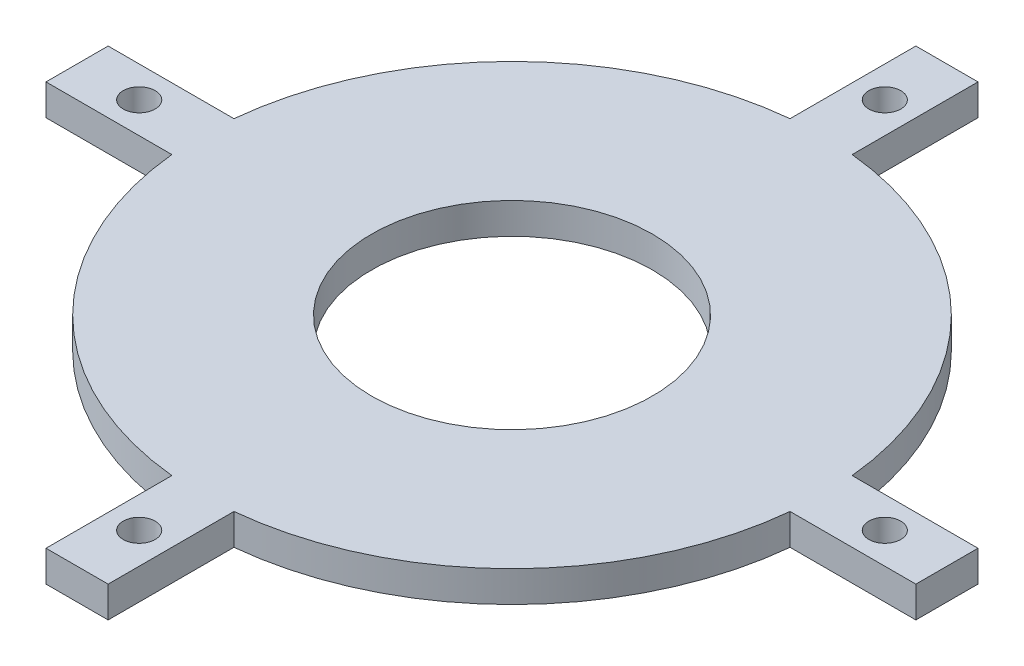
ISO-10303-21;
HEADER;
FILE_DESCRIPTION(('STEP AP214'),'2;1');
FILE_NAME('part.step','',(''),(''),'','','');
FILE_SCHEMA(('AUTOMOTIVE_DESIGN { 1 0 10303 214 1 1 1 1 }'));
ENDSEC;
DATA;
#1=APPLICATION_CONTEXT('core data for automotive mechanical design processes');
#2=APPLICATION_PROTOCOL_DEFINITION('international standard','automotive_design',2000,#1);
#3=PRODUCT_CONTEXT('',#1,'mechanical');
#4=PRODUCT('Part','Part','',(#3));
#5=PRODUCT_RELATED_PRODUCT_CATEGORY('part','',(#4));
#6=PRODUCT_DEFINITION_FORMATION('','',#4);
#7=PRODUCT_DEFINITION_CONTEXT('part definition',#1,'design');
#8=PRODUCT_DEFINITION('design','',#6,#7);
#9=PRODUCT_DEFINITION_SHAPE('','',#8);
#10=(LENGTH_UNIT() NAMED_UNIT(*) SI_UNIT(.MILLI.,.METRE.));
#11=(NAMED_UNIT(*) PLANE_ANGLE_UNIT() SI_UNIT($,.RADIAN.));
#12=(NAMED_UNIT(*) SI_UNIT($,.STERADIAN.) SOLID_ANGLE_UNIT());
#13=UNCERTAINTY_MEASURE_WITH_UNIT(LENGTH_MEASURE(1.E-05),#10,'distance_accuracy_value','');
#14=(GEOMETRIC_REPRESENTATION_CONTEXT(3) GLOBAL_UNCERTAINTY_ASSIGNED_CONTEXT((#13)) GLOBAL_UNIT_ASSIGNED_CONTEXT((#10,
#11,#12)) REPRESENTATION_CONTEXT('',''));
#15=CARTESIAN_POINT('',(0.,0.,0.));
#16=DIRECTION('',(0.,0.,1.));
#17=DIRECTION('',(1.,0.,0.));
#18=AXIS2_PLACEMENT_3D('',#15,#16,#17);
#19=CARTESIAN_POINT('',(0.,3.175,0.));
#20=DIRECTION('',(0.,1.,0.));
#21=DIRECTION('',(0.,0.,1.));
#22=AXIS2_PLACEMENT_3D('',#19,#20,#21);
#23=PLANE('',#22);
#24=CARTESIAN_POINT('',(38.1,3.175,-3.9907631702977E-13));
#25=DIRECTION('',(0.,1.,0.));
#26=DIRECTION('',(0.,0.,1.));
#27=AXIS2_PLACEMENT_3D('',#24,#25,#26);
#28=CIRCLE('',#27,1.63194999999999);
#29=CARTESIAN_POINT('',(38.1,3.175,1.63194999999959));
#30=VERTEX_POINT('',#29);
#31=EDGE_CURVE('E290',#30,#30,#28,.T.);
#32=ORIENTED_EDGE('',*,*,#31,.F.);
#33=EDGE_LOOP('',(#32));
#34=FACE_BOUND('',#33,.T.);
#35=CARTESIAN_POINT('',(0.,3.175,38.1));
#36=DIRECTION('',(0.,1.,0.));
#37=DIRECTION('',(0.,0.,1.));
#38=AXIS2_PLACEMENT_3D('',#35,#36,#37);
#39=CIRCLE('',#38,1.63194999999999);
#40=CARTESIAN_POINT('',(0.,3.175,39.73195));
#41=VERTEX_POINT('',#40);
#42=EDGE_CURVE('E280',#41,#41,#39,.T.);
#43=ORIENTED_EDGE('',*,*,#42,.F.);
#44=EDGE_LOOP('',(#43));
#45=FACE_BOUND('',#44,.T.);
#46=CARTESIAN_POINT('',(-38.1,3.175,1.33025439009923E-13));
#47=DIRECTION('',(0.,1.,0.));
#48=DIRECTION('',(0.,0.,1.));
#49=AXIS2_PLACEMENT_3D('',#46,#47,#48);
#50=CIRCLE('',#49,1.63194999999999);
#51=CARTESIAN_POINT('',(-38.1,3.175,1.63195000000012));
#52=VERTEX_POINT('',#51);
#53=EDGE_CURVE('E277',#52,#52,#50,.T.);
#54=ORIENTED_EDGE('',*,*,#53,.F.);
#55=EDGE_LOOP('',(#54));
#56=FACE_BOUND('',#55,.T.);
#57=CARTESIAN_POINT('',(0.,3.175,-38.1));
#58=DIRECTION('',(0.,1.,0.));
#59=DIRECTION('',(0.,0.,1.));
#60=AXIS2_PLACEMENT_3D('',#57,#58,#59);
#61=CIRCLE('',#60,1.63194999999999);
#62=CARTESIAN_POINT('',(0.,3.175,-36.46805));
#63=VERTEX_POINT('',#62);
#64=EDGE_CURVE('E274',#63,#63,#61,.T.);
#65=ORIENTED_EDGE('',*,*,#64,.F.);
#66=EDGE_LOOP('',(#65));
#67=FACE_BOUND('',#66,.T.);
#68=CARTESIAN_POINT('',(0.,3.175,0.));
#69=DIRECTION('',(0.,1.,0.));
#70=DIRECTION('',(0.,0.,1.));
#71=AXIS2_PLACEMENT_3D('',#68,#69,#70);
#72=CIRCLE('',#71,14.351);
#73=CARTESIAN_POINT('',(0.,3.175,14.351));
#74=VERTEX_POINT('',#73);
#75=EDGE_CURVE('E206',#74,#74,#72,.T.);
#76=ORIENTED_EDGE('',*,*,#75,.F.);
#77=EDGE_LOOP('',(#76));
#78=FACE_BOUND('',#77,.T.);
#79=DIRECTION('',(-1.,0.,0.));
#80=VECTOR('',#79,1.);
#81=CARTESIAN_POINT('',(0.,3.175,-44.45));
#82=LINE('',#81,#80);
#83=CARTESIAN_POINT('',(3.17499999999999,3.175,-44.45));
#84=VERTEX_POINT('',#83);
#85=CARTESIAN_POINT('',(-3.17500000000001,3.175,-44.45));
#86=VERTEX_POINT('',#85);
#87=EDGE_CURVE('E159',#84,#86,#82,.T.);
#88=ORIENTED_EDGE('',*,*,#87,.T.);
#89=DIRECTION('',(0.,0.,1.));
#90=VECTOR('',#89,1.);
#91=CARTESIAN_POINT('',(-3.175,3.175,0.));
#92=LINE('',#91,#90);
#93=CARTESIAN_POINT('',(-3.17500000000001,3.175,-31.5908511281352));
#94=VERTEX_POINT('',#93);
#95=EDGE_CURVE('E50',#86,#94,#92,.T.);
#96=ORIENTED_EDGE('',*,*,#95,.T.);
#97=CARTESIAN_POINT('',(0.,3.175,0.));
#98=DIRECTION('',(0.,1.,0.));
#99=DIRECTION('',(0.,0.,1.));
#100=AXIS2_PLACEMENT_3D('',#97,#98,#99);
#101=CIRCLE('',#100,31.75);
#102=CARTESIAN_POINT('',(-31.5908511281352,3.175,-3.175));
#103=VERTEX_POINT('',#102);
#104=EDGE_CURVE('E201',#94,#103,#101,.T.);
#105=ORIENTED_EDGE('',*,*,#104,.T.);
#106=DIRECTION('',(1.,0.,0.));
#107=VECTOR('',#106,1.);
#108=CARTESIAN_POINT('',(0.,3.175,-3.175));
#109=LINE('',#108,#107);
#110=CARTESIAN_POINT('',(-44.45,3.175,-3.175));
#111=VERTEX_POINT('',#110);
#112=EDGE_CURVE('E198',#111,#103,#109,.T.);
#113=ORIENTED_EDGE('',*,*,#112,.F.);
#114=DIRECTION('',(0.,0.,1.));
#115=VECTOR('',#114,1.);
#116=CARTESIAN_POINT('',(-44.45,3.175,0.));
#117=LINE('',#116,#115);
#118=CARTESIAN_POINT('',(-44.45,3.175,3.175));
#119=VERTEX_POINT('',#118);
#120=EDGE_CURVE('E195',#111,#119,#117,.T.);
#121=ORIENTED_EDGE('',*,*,#120,.T.);
#122=DIRECTION('',(1.,0.,0.));
#123=VECTOR('',#122,1.);
#124=CARTESIAN_POINT('',(0.,3.175,3.175));
#125=LINE('',#124,#123);
#126=CARTESIAN_POINT('',(-31.5908511281352,3.175,3.175));
#127=VERTEX_POINT('',#126);
#128=EDGE_CURVE('E187',#119,#127,#125,.T.);
#129=ORIENTED_EDGE('',*,*,#128,.T.);
#130=CARTESIAN_POINT('',(0.,3.175,0.));
#131=DIRECTION('',(0.,1.,0.));
#132=DIRECTION('',(0.,0.,1.));
#133=AXIS2_PLACEMENT_3D('',#130,#131,#132);
#134=CIRCLE('',#133,31.75);
#135=CARTESIAN_POINT('',(-3.175,3.175,31.5908511281352));
#136=VERTEX_POINT('',#135);
#137=EDGE_CURVE('E192',#127,#136,#134,.T.);
#138=ORIENTED_EDGE('',*,*,#137,.T.);
#139=DIRECTION('',(0.,0.,1.));
#140=VECTOR('',#139,1.);
#141=CARTESIAN_POINT('',(-3.175,3.175,0.));
#142=LINE('',#141,#140);
#143=CARTESIAN_POINT('',(-3.17499999999999,3.175,44.45));
#144=VERTEX_POINT('',#143);
#145=EDGE_CURVE('E178',#136,#144,#142,.T.);
#146=ORIENTED_EDGE('',*,*,#145,.T.);
#147=DIRECTION('',(-1.,0.,0.));
#148=VECTOR('',#147,1.);
#149=CARTESIAN_POINT('',(0.,3.175,44.45));
#150=LINE('',#149,#148);
#151=CARTESIAN_POINT('',(3.175,3.175,44.45));
#152=VERTEX_POINT('',#151);
#153=EDGE_CURVE('E171',#152,#144,#150,.T.);
#154=ORIENTED_EDGE('',*,*,#153,.F.);
#155=DIRECTION('',(0.,0.,1.));
#156=VECTOR('',#155,1.);
#157=CARTESIAN_POINT('',(3.175,3.175,0.));
#158=LINE('',#157,#156);
#159=CARTESIAN_POINT('',(3.175,3.175,31.5908511281352));
#160=VERTEX_POINT('',#159);
#161=EDGE_CURVE('E167',#160,#152,#158,.T.);
#162=ORIENTED_EDGE('',*,*,#161,.F.);
#163=CARTESIAN_POINT('',(0.,3.175,0.));
#164=DIRECTION('',(0.,1.,0.));
#165=DIRECTION('',(0.,0.,1.));
#166=AXIS2_PLACEMENT_3D('',#163,#164,#165);
#167=CIRCLE('',#166,31.75);
#168=CARTESIAN_POINT('',(31.5908511281352,3.175,3.175));
#169=VERTEX_POINT('',#168);
#170=EDGE_CURVE('E172',#160,#169,#167,.T.);
#171=ORIENTED_EDGE('',*,*,#170,.T.);
#172=CARTESIAN_POINT('',(44.45,3.175,3.175));
#173=VERTEX_POINT('',#172);
#174=EDGE_CURVE('E181',#169,#173,#125,.T.);
#175=ORIENTED_EDGE('',*,*,#174,.T.);
#176=DIRECTION('',(0.,0.,1.));
#177=VECTOR('',#176,1.);
#178=CARTESIAN_POINT('',(44.45,3.175,0.));
#179=LINE('',#178,#177);
#180=CARTESIAN_POINT('',(44.45,3.175,-3.175));
#181=VERTEX_POINT('',#180);
#182=EDGE_CURVE('E185',#181,#173,#179,.T.);
#183=ORIENTED_EDGE('',*,*,#182,.F.);
#184=DIRECTION('',(1.,0.,0.));
#185=VECTOR('',#184,1.);
#186=CARTESIAN_POINT('',(0.,3.175,-3.175));
#187=LINE('',#186,#185);
#188=CARTESIAN_POINT('',(31.5908511281352,3.175,-3.175));
#189=VERTEX_POINT('',#188);
#190=EDGE_CURVE('E168',#189,#181,#187,.T.);
#191=ORIENTED_EDGE('',*,*,#190,.F.);
#192=CARTESIAN_POINT('',(0.,3.175,0.));
#193=DIRECTION('',(0.,1.,0.));
#194=DIRECTION('',(0.,0.,1.));
#195=AXIS2_PLACEMENT_3D('',#192,#193,#194);
#196=CIRCLE('',#195,31.75);
#197=CARTESIAN_POINT('',(3.17499999999999,3.175,-31.5908511281352));
#198=VERTEX_POINT('',#197);
#199=EDGE_CURVE('E165',#189,#198,#196,.T.);
#200=ORIENTED_EDGE('',*,*,#199,.T.);
#201=EDGE_CURVE('E150',#84,#198,#158,.T.);
#202=ORIENTED_EDGE('',*,*,#201,.F.);
#203=EDGE_LOOP('',(#88,#96,#105,#113,#121,#129,#138,#146,#154,#162,#171,#175,#183,#191,#200,#202));
#204=FACE_BOUND('',#203,.T.);
#205=ADVANCED_FACE('F33',(#34,#45,#56,#67,#78,#204),#23,.T.);
#206=CARTESIAN_POINT('',(0.,0.,0.));
#207=DIRECTION('',(0.,1.,0.));
#208=DIRECTION('',(0.,0.,1.));
#209=AXIS2_PLACEMENT_3D('',#206,#207,#208);
#210=PLANE('',#209);
#211=CARTESIAN_POINT('',(38.1,0.,-3.9907631702977E-13));
#212=DIRECTION('',(0.,1.,0.));
#213=DIRECTION('',(0.,0.,1.));
#214=AXIS2_PLACEMENT_3D('',#211,#212,#213);
#215=CIRCLE('',#214,1.63194999999999);
#216=CARTESIAN_POINT('',(38.1,0.,1.63194999999959));
#217=VERTEX_POINT('',#216);
#218=EDGE_CURVE('E37',#217,#217,#215,.T.);
#219=ORIENTED_EDGE('',*,*,#218,.T.);
#220=EDGE_LOOP('',(#219));
#221=FACE_BOUND('',#220,.T.);
#222=CARTESIAN_POINT('',(0.,0.,38.1));
#223=DIRECTION('',(0.,1.,0.));
#224=DIRECTION('',(0.,0.,1.));
#225=AXIS2_PLACEMENT_3D('',#222,#223,#224);
#226=CIRCLE('',#225,1.63194999999999);
#227=CARTESIAN_POINT('',(0.,0.,39.73195));
#228=VERTEX_POINT('',#227);
#229=EDGE_CURVE('E278',#228,#228,#226,.T.);
#230=ORIENTED_EDGE('',*,*,#229,.T.);
#231=EDGE_LOOP('',(#230));
#232=FACE_BOUND('',#231,.T.);
#233=CARTESIAN_POINT('',(-38.1,0.,1.33025439009923E-13));
#234=DIRECTION('',(0.,1.,0.));
#235=DIRECTION('',(0.,0.,1.));
#236=AXIS2_PLACEMENT_3D('',#233,#234,#235);
#237=CIRCLE('',#236,1.63194999999999);
#238=CARTESIAN_POINT('',(-38.1,0.,1.63195000000012));
#239=VERTEX_POINT('',#238);
#240=EDGE_CURVE('E275',#239,#239,#237,.T.);
#241=ORIENTED_EDGE('',*,*,#240,.T.);
#242=EDGE_LOOP('',(#241));
#243=FACE_BOUND('',#242,.T.);
#244=CARTESIAN_POINT('',(0.,0.,-38.1));
#245=DIRECTION('',(0.,1.,0.));
#246=DIRECTION('',(0.,0.,1.));
#247=AXIS2_PLACEMENT_3D('',#244,#245,#246);
#248=CIRCLE('',#247,1.63194999999999);
#249=CARTESIAN_POINT('',(0.,0.,-36.46805));
#250=VERTEX_POINT('',#249);
#251=EDGE_CURVE('E271',#250,#250,#248,.T.);
#252=ORIENTED_EDGE('',*,*,#251,.T.);
#253=EDGE_LOOP('',(#252));
#254=FACE_BOUND('',#253,.T.);
#255=CARTESIAN_POINT('',(0.,0.,0.));
#256=DIRECTION('',(0.,1.,0.));
#257=DIRECTION('',(0.,0.,1.));
#258=AXIS2_PLACEMENT_3D('',#255,#256,#257);
#259=CIRCLE('',#258,14.351);
#260=CARTESIAN_POINT('',(0.,0.,14.351));
#261=VERTEX_POINT('',#260);
#262=EDGE_CURVE('E233',#261,#261,#259,.T.);
#263=ORIENTED_EDGE('',*,*,#262,.T.);
#264=EDGE_LOOP('',(#263));
#265=FACE_BOUND('',#264,.T.);
#266=DIRECTION('',(0.,0.,1.));
#267=VECTOR('',#266,1.);
#268=CARTESIAN_POINT('',(-3.175,0.,0.));
#269=LINE('',#268,#267);
#270=CARTESIAN_POINT('',(-3.17500000000001,0.,-44.45));
#271=VERTEX_POINT('',#270);
#272=CARTESIAN_POINT('',(-3.17500000000001,0.,-31.5908511281352));
#273=VERTEX_POINT('',#272);
#274=EDGE_CURVE('E11',#271,#273,#269,.T.);
#275=ORIENTED_EDGE('',*,*,#274,.F.);
#276=DIRECTION('',(-1.,0.,0.));
#277=VECTOR('',#276,1.);
#278=CARTESIAN_POINT('',(0.,0.,-44.45));
#279=LINE('',#278,#277);
#280=CARTESIAN_POINT('',(3.17499999999999,0.,-44.45));
#281=VERTEX_POINT('',#280);
#282=EDGE_CURVE('E236',#281,#271,#279,.T.);
#283=ORIENTED_EDGE('',*,*,#282,.F.);
#284=DIRECTION('',(0.,0.,1.));
#285=VECTOR('',#284,1.);
#286=CARTESIAN_POINT('',(3.175,0.,0.));
#287=LINE('',#286,#285);
#288=CARTESIAN_POINT('',(3.17499999999999,0.,-31.5908511281352));
#289=VERTEX_POINT('',#288);
#290=EDGE_CURVE('E153',#281,#289,#287,.T.);
#291=ORIENTED_EDGE('',*,*,#290,.T.);
#292=CARTESIAN_POINT('',(0.,0.,0.));
#293=DIRECTION('',(0.,1.,0.));
#294=DIRECTION('',(0.,0.,1.));
#295=AXIS2_PLACEMENT_3D('',#292,#293,#294);
#296=CIRCLE('',#295,31.75);
#297=CARTESIAN_POINT('',(31.5908511281352,0.,-3.175));
#298=VERTEX_POINT('',#297);
#299=EDGE_CURVE('E241',#298,#289,#296,.T.);
#300=ORIENTED_EDGE('',*,*,#299,.F.);
#301=DIRECTION('',(1.,0.,0.));
#302=VECTOR('',#301,1.);
#303=CARTESIAN_POINT('',(0.,0.,-3.175));
#304=LINE('',#303,#302);
#305=CARTESIAN_POINT('',(44.45,0.,-3.175));
#306=VERTEX_POINT('',#305);
#307=EDGE_CURVE('E243',#298,#306,#304,.T.);
#308=ORIENTED_EDGE('',*,*,#307,.T.);
#309=DIRECTION('',(0.,0.,1.));
#310=VECTOR('',#309,1.);
#311=CARTESIAN_POINT('',(44.45,0.,0.));
#312=LINE('',#311,#310);
#313=CARTESIAN_POINT('',(44.45,0.,3.175));
#314=VERTEX_POINT('',#313);
#315=EDGE_CURVE('E246',#306,#314,#312,.T.);
#316=ORIENTED_EDGE('',*,*,#315,.T.);
#317=DIRECTION('',(1.,0.,0.));
#318=VECTOR('',#317,1.);
#319=CARTESIAN_POINT('',(0.,0.,3.175));
#320=LINE('',#319,#318);
#321=CARTESIAN_POINT('',(31.5908511281352,0.,3.175));
#322=VERTEX_POINT('',#321);
#323=EDGE_CURVE('E249',#322,#314,#320,.T.);
#324=ORIENTED_EDGE('',*,*,#323,.F.);
#325=CARTESIAN_POINT('',(0.,0.,0.));
#326=DIRECTION('',(0.,1.,0.));
#327=DIRECTION('',(0.,0.,1.));
#328=AXIS2_PLACEMENT_3D('',#325,#326,#327);
#329=CIRCLE('',#328,31.75);
#330=CARTESIAN_POINT('',(3.175,0.,31.5908511281352));
#331=VERTEX_POINT('',#330);
#332=EDGE_CURVE('E251',#331,#322,#329,.T.);
#333=ORIENTED_EDGE('',*,*,#332,.F.);
#334=DIRECTION('',(0.,0.,1.));
#335=VECTOR('',#334,1.);
#336=CARTESIAN_POINT('',(3.175,0.,0.));
#337=LINE('',#336,#335);
#338=CARTESIAN_POINT('',(3.175,0.,44.45));
#339=VERTEX_POINT('',#338);
#340=EDGE_CURVE('E253',#331,#339,#337,.T.);
#341=ORIENTED_EDGE('',*,*,#340,.T.);
#342=DIRECTION('',(-1.,0.,0.));
#343=VECTOR('',#342,1.);
#344=CARTESIAN_POINT('',(0.,0.,44.45));
#345=LINE('',#344,#343);
#346=CARTESIAN_POINT('',(-3.17499999999999,0.,44.45));
#347=VERTEX_POINT('',#346);
#348=EDGE_CURVE('E256',#339,#347,#345,.T.);
#349=ORIENTED_EDGE('',*,*,#348,.T.);
#350=DIRECTION('',(0.,0.,1.));
#351=VECTOR('',#350,1.);
#352=CARTESIAN_POINT('',(-3.175,0.,0.));
#353=LINE('',#352,#351);
#354=CARTESIAN_POINT('',(-3.175,0.,31.5908511281352));
#355=VERTEX_POINT('',#354);
#356=EDGE_CURVE('E259',#355,#347,#353,.T.);
#357=ORIENTED_EDGE('',*,*,#356,.F.);
#358=CARTESIAN_POINT('',(0.,0.,0.));
#359=DIRECTION('',(0.,1.,0.));
#360=DIRECTION('',(0.,0.,1.));
#361=AXIS2_PLACEMENT_3D('',#358,#359,#360);
#362=CIRCLE('',#361,31.75);
#363=CARTESIAN_POINT('',(-31.5908511281352,0.,3.175));
#364=VERTEX_POINT('',#363);
#365=EDGE_CURVE('E261',#364,#355,#362,.T.);
#366=ORIENTED_EDGE('',*,*,#365,.F.);
#367=DIRECTION('',(1.,0.,0.));
#368=VECTOR('',#367,1.);
#369=CARTESIAN_POINT('',(0.,0.,3.175));
#370=LINE('',#369,#368);
#371=CARTESIAN_POINT('',(-44.45,0.,3.175));
#372=VERTEX_POINT('',#371);
#373=EDGE_CURVE('E263',#372,#364,#370,.T.);
#374=ORIENTED_EDGE('',*,*,#373,.F.);
#375=DIRECTION('',(0.,0.,1.));
#376=VECTOR('',#375,1.);
#377=CARTESIAN_POINT('',(-44.45,0.,0.));
#378=LINE('',#377,#376);
#379=CARTESIAN_POINT('',(-44.45,0.,-3.175));
#380=VERTEX_POINT('',#379);
#381=EDGE_CURVE('E265',#380,#372,#378,.T.);
#382=ORIENTED_EDGE('',*,*,#381,.F.);
#383=DIRECTION('',(1.,0.,0.));
#384=VECTOR('',#383,1.);
#385=CARTESIAN_POINT('',(0.,0.,-3.175));
#386=LINE('',#385,#384);
#387=CARTESIAN_POINT('',(-31.5908511281352,0.,-3.175));
#388=VERTEX_POINT('',#387);
#389=EDGE_CURVE('E267',#380,#388,#386,.T.);
#390=ORIENTED_EDGE('',*,*,#389,.T.);
#391=CARTESIAN_POINT('',(0.,0.,0.));
#392=DIRECTION('',(0.,1.,0.));
#393=DIRECTION('',(0.,0.,1.));
#394=AXIS2_PLACEMENT_3D('',#391,#392,#393);
#395=CIRCLE('',#394,31.75);
#396=EDGE_CURVE('E42',#273,#388,#395,.T.);
#397=ORIENTED_EDGE('',*,*,#396,.F.);
#398=EDGE_LOOP('',(#275,#283,#291,#300,#308,#316,#324,#333,#341,#349,#357,#366,#374,#382,#390,#397));
#399=FACE_BOUND('',#398,.T.);
#400=ADVANCED_FACE('F35',(#221,#232,#243,#254,#265,#399),#210,.F.);
#401=CARTESIAN_POINT('',(0.,0.,0.));
#402=DIRECTION('',(0.,1.,0.));
#403=DIRECTION('',(0.,0.,1.));
#404=AXIS2_PLACEMENT_3D('',#401,#402,#403);
#405=CYLINDRICAL_SURFACE('',#404,14.351);
#406=ORIENTED_EDGE('',*,*,#262,.F.);
#407=EDGE_LOOP('',(#406));
#408=FACE_BOUND('',#407,.T.);
#409=ORIENTED_EDGE('',*,*,#75,.T.);
#410=EDGE_LOOP('',(#409));
#411=FACE_BOUND('',#410,.T.);
#412=ADVANCED_FACE('F355',(#408,#411),#405,.F.);
#413=CARTESIAN_POINT('',(-3.175,-1.905,0.));
#414=DIRECTION('',(-1.,0.,0.));
#415=DIRECTION('',(0.,0.,1.));
#416=AXIS2_PLACEMENT_3D('',#413,#414,#415);
#417=PLANE('',#416);
#418=ORIENTED_EDGE('',*,*,#274,.T.);
#419=DIRECTION('',(0.,1.,0.));
#420=VECTOR('',#419,1.);
#421=CARTESIAN_POINT('',(-3.17500000000001,-1.905,-31.5908511281352));
#422=LINE('',#421,#420);
#423=EDGE_CURVE('E204',#273,#94,#422,.T.);
#424=ORIENTED_EDGE('',*,*,#423,.T.);
#425=ORIENTED_EDGE('',*,*,#95,.F.);
#426=DIRECTION('',(0.,1.,0.));
#427=VECTOR('',#426,1.);
#428=CARTESIAN_POINT('',(-3.17500000000001,-1.905,-44.45));
#429=LINE('',#428,#427);
#430=EDGE_CURVE('E156',#271,#86,#429,.T.);
#431=ORIENTED_EDGE('',*,*,#430,.F.);
#432=EDGE_LOOP('',(#418,#424,#425,#431));
#433=FACE_BOUND('',#432,.T.);
#434=ADVANCED_FACE('F353',(#433),#417,.T.);
#435=CARTESIAN_POINT('',(0.,-1.905,0.));
#436=DIRECTION('',(0.,1.,0.));
#437=DIRECTION('',(0.,0.,1.));
#438=AXIS2_PLACEMENT_3D('',#435,#436,#437);
#439=CYLINDRICAL_SURFACE('',#438,31.75);
#440=ORIENTED_EDGE('',*,*,#396,.T.);
#441=DIRECTION('',(0.,1.,0.));
#442=VECTOR('',#441,1.);
#443=CARTESIAN_POINT('',(-31.5908511281352,-1.905,-3.175));
#444=LINE('',#443,#442);
#445=EDGE_CURVE('E207',#388,#103,#444,.T.);
#446=ORIENTED_EDGE('',*,*,#445,.T.);
#447=ORIENTED_EDGE('',*,*,#104,.F.);
#448=ORIENTED_EDGE('',*,*,#423,.F.);
#449=EDGE_LOOP('',(#440,#446,#447,#448));
#450=FACE_BOUND('',#449,.T.);
#451=ADVANCED_FACE('F299',(#450),#439,.T.);
#452=CARTESIAN_POINT('',(0.,-1.905,-3.175));
#453=DIRECTION('',(0.,0.,1.));
#454=DIRECTION('',(1.,0.,0.));
#455=AXIS2_PLACEMENT_3D('',#452,#453,#454);
#456=PLANE('',#455);
#457=DIRECTION('',(0.,1.,0.));
#458=VECTOR('',#457,1.);
#459=CARTESIAN_POINT('',(-44.45,-1.905,-3.175));
#460=LINE('',#459,#458);
#461=EDGE_CURVE('E209',#380,#111,#460,.T.);
#462=ORIENTED_EDGE('',*,*,#461,.T.);
#463=ORIENTED_EDGE('',*,*,#112,.T.);
#464=ORIENTED_EDGE('',*,*,#445,.F.);
#465=ORIENTED_EDGE('',*,*,#389,.F.);
#466=EDGE_LOOP('',(#462,#463,#464,#465));
#467=FACE_BOUND('',#466,.T.);
#468=ADVANCED_FACE('F303',(#467),#456,.F.);
#469=CARTESIAN_POINT('',(-44.45,-1.905,0.));
#470=DIRECTION('',(-1.,0.,0.));
#471=DIRECTION('',(0.,0.,1.));
#472=AXIS2_PLACEMENT_3D('',#469,#470,#471);
#473=PLANE('',#472);
#474=ORIENTED_EDGE('',*,*,#381,.T.);
#475=DIRECTION('',(0.,1.,0.));
#476=VECTOR('',#475,1.);
#477=CARTESIAN_POINT('',(-44.45,-1.905,3.175));
#478=LINE('',#477,#476);
#479=EDGE_CURVE('E211',#372,#119,#478,.T.);
#480=ORIENTED_EDGE('',*,*,#479,.T.);
#481=ORIENTED_EDGE('',*,*,#120,.F.);
#482=ORIENTED_EDGE('',*,*,#461,.F.);
#483=EDGE_LOOP('',(#474,#480,#481,#482));
#484=FACE_BOUND('',#483,.T.);
#485=ADVANCED_FACE('F308',(#484),#473,.T.);
#486=CARTESIAN_POINT('',(0.,-1.905,3.175));
#487=DIRECTION('',(0.,0.,1.));
#488=DIRECTION('',(1.,0.,0.));
#489=AXIS2_PLACEMENT_3D('',#486,#487,#488);
#490=PLANE('',#489);
#491=ORIENTED_EDGE('',*,*,#373,.T.);
#492=DIRECTION('',(0.,1.,0.));
#493=VECTOR('',#492,1.);
#494=CARTESIAN_POINT('',(-31.5908511281352,-1.905,3.175));
#495=LINE('',#494,#493);
#496=EDGE_CURVE('E213',#364,#127,#495,.T.);
#497=ORIENTED_EDGE('',*,*,#496,.T.);
#498=ORIENTED_EDGE('',*,*,#128,.F.);
#499=ORIENTED_EDGE('',*,*,#479,.F.);
#500=EDGE_LOOP('',(#491,#497,#498,#499));
#501=FACE_BOUND('',#500,.T.);
#502=ADVANCED_FACE('F314',(#501),#490,.T.);
#503=CARTESIAN_POINT('',(0.,-1.905,0.));
#504=DIRECTION('',(0.,1.,0.));
#505=DIRECTION('',(0.,0.,1.));
#506=AXIS2_PLACEMENT_3D('',#503,#504,#505);
#507=CYLINDRICAL_SURFACE('',#506,31.75);
#508=ORIENTED_EDGE('',*,*,#365,.T.);
#509=DIRECTION('',(0.,1.,0.));
#510=VECTOR('',#509,1.);
#511=CARTESIAN_POINT('',(-3.175,-1.905,31.5908511281352));
#512=LINE('',#511,#510);
#513=EDGE_CURVE('E215',#355,#136,#512,.T.);
#514=ORIENTED_EDGE('',*,*,#513,.T.);
#515=ORIENTED_EDGE('',*,*,#137,.F.);
#516=ORIENTED_EDGE('',*,*,#496,.F.);
#517=EDGE_LOOP('',(#508,#514,#515,#516));
#518=FACE_BOUND('',#517,.T.);
#519=ADVANCED_FACE('F319',(#518),#507,.T.);
#520=CARTESIAN_POINT('',(-3.175,-1.905,0.));
#521=DIRECTION('',(-1.,0.,0.));
#522=DIRECTION('',(0.,0.,1.));
#523=AXIS2_PLACEMENT_3D('',#520,#521,#522);
#524=PLANE('',#523);
#525=ORIENTED_EDGE('',*,*,#356,.T.);
#526=DIRECTION('',(0.,1.,0.));
#527=VECTOR('',#526,1.);
#528=CARTESIAN_POINT('',(-3.17499999999999,-1.905,44.45));
#529=LINE('',#528,#527);
#530=EDGE_CURVE('E217',#347,#144,#529,.T.);
#531=ORIENTED_EDGE('',*,*,#530,.T.);
#532=ORIENTED_EDGE('',*,*,#145,.F.);
#533=ORIENTED_EDGE('',*,*,#513,.F.);
#534=EDGE_LOOP('',(#525,#531,#532,#533));
#535=FACE_BOUND('',#534,.T.);
#536=ADVANCED_FACE('F324',(#535),#524,.T.);
#537=CARTESIAN_POINT('',(0.,-1.905,44.45));
#538=DIRECTION('',(0.,0.,-1.));
#539=DIRECTION('',(-1.,0.,0.));
#540=AXIS2_PLACEMENT_3D('',#537,#538,#539);
#541=PLANE('',#540);
#542=DIRECTION('',(0.,1.,0.));
#543=VECTOR('',#542,1.);
#544=CARTESIAN_POINT('',(3.175,-1.905,44.45));
#545=LINE('',#544,#543);
#546=EDGE_CURVE('E219',#339,#152,#545,.T.);
#547=ORIENTED_EDGE('',*,*,#546,.T.);
#548=ORIENTED_EDGE('',*,*,#153,.T.);
#549=ORIENTED_EDGE('',*,*,#530,.F.);
#550=ORIENTED_EDGE('',*,*,#348,.F.);
#551=EDGE_LOOP('',(#547,#548,#549,#550));
#552=FACE_BOUND('',#551,.T.);
#553=ADVANCED_FACE('F327',(#552),#541,.F.);
#554=CARTESIAN_POINT('',(3.175,-1.905,0.));
#555=DIRECTION('',(-1.,0.,0.));
#556=DIRECTION('',(0.,0.,1.));
#557=AXIS2_PLACEMENT_3D('',#554,#555,#556);
#558=PLANE('',#557);
#559=DIRECTION('',(0.,1.,0.));
#560=VECTOR('',#559,1.);
#561=CARTESIAN_POINT('',(3.175,-1.905,31.5908511281352));
#562=LINE('',#561,#560);
#563=EDGE_CURVE('E221',#331,#160,#562,.T.);
#564=ORIENTED_EDGE('',*,*,#563,.T.);
#565=ORIENTED_EDGE('',*,*,#161,.T.);
#566=ORIENTED_EDGE('',*,*,#546,.F.);
#567=ORIENTED_EDGE('',*,*,#340,.F.);
#568=EDGE_LOOP('',(#564,#565,#566,#567));
#569=FACE_BOUND('',#568,.T.);
#570=ADVANCED_FACE('F328',(#569),#558,.F.);
#571=CARTESIAN_POINT('',(0.,-1.905,0.));
#572=DIRECTION('',(0.,1.,0.));
#573=DIRECTION('',(0.,0.,1.));
#574=AXIS2_PLACEMENT_3D('',#571,#572,#573);
#575=CYLINDRICAL_SURFACE('',#574,31.75);
#576=ORIENTED_EDGE('',*,*,#332,.T.);
#577=DIRECTION('',(0.,1.,0.));
#578=VECTOR('',#577,1.);
#579=CARTESIAN_POINT('',(31.5908511281352,-1.905,3.175));
#580=LINE('',#579,#578);
#581=EDGE_CURVE('E223',#322,#169,#580,.T.);
#582=ORIENTED_EDGE('',*,*,#581,.T.);
#583=ORIENTED_EDGE('',*,*,#170,.F.);
#584=ORIENTED_EDGE('',*,*,#563,.F.);
#585=EDGE_LOOP('',(#576,#582,#583,#584));
#586=FACE_BOUND('',#585,.T.);
#587=ADVANCED_FACE('F336',(#586),#575,.T.);
#588=ORIENTED_EDGE('',*,*,#323,.T.);
#589=DIRECTION('',(0.,1.,0.));
#590=VECTOR('',#589,1.);
#591=CARTESIAN_POINT('',(44.45,-1.905,3.175));
#592=LINE('',#591,#590);
#593=EDGE_CURVE('E225',#314,#173,#592,.T.);
#594=ORIENTED_EDGE('',*,*,#593,.T.);
#595=ORIENTED_EDGE('',*,*,#174,.F.);
#596=ORIENTED_EDGE('',*,*,#581,.F.);
#597=EDGE_LOOP('',(#588,#594,#595,#596));
#598=FACE_BOUND('',#597,.T.);
#599=ADVANCED_FACE('F339',(#598),#490,.T.);
#600=CARTESIAN_POINT('',(44.45,-1.905,0.));
#601=DIRECTION('',(-1.,0.,0.));
#602=DIRECTION('',(0.,0.,1.));
#603=AXIS2_PLACEMENT_3D('',#600,#601,#602);
#604=PLANE('',#603);
#605=DIRECTION('',(0.,1.,0.));
#606=VECTOR('',#605,1.);
#607=CARTESIAN_POINT('',(44.45,-1.905,-3.175));
#608=LINE('',#607,#606);
#609=EDGE_CURVE('E227',#306,#181,#608,.T.);
#610=ORIENTED_EDGE('',*,*,#609,.T.);
#611=ORIENTED_EDGE('',*,*,#182,.T.);
#612=ORIENTED_EDGE('',*,*,#593,.F.);
#613=ORIENTED_EDGE('',*,*,#315,.F.);
#614=EDGE_LOOP('',(#610,#611,#612,#613));
#615=FACE_BOUND('',#614,.T.);
#616=ADVANCED_FACE('F416',(#615),#604,.F.);
#617=CARTESIAN_POINT('',(0.,-1.905,-3.175));
#618=DIRECTION('',(0.,0.,1.));
#619=DIRECTION('',(1.,0.,0.));
#620=AXIS2_PLACEMENT_3D('',#617,#618,#619);
#621=PLANE('',#620);
#622=DIRECTION('',(0.,1.,0.));
#623=VECTOR('',#622,1.);
#624=CARTESIAN_POINT('',(31.5908511281352,-1.905,-3.175));
#625=LINE('',#624,#623);
#626=EDGE_CURVE('E229',#298,#189,#625,.T.);
#627=ORIENTED_EDGE('',*,*,#626,.T.);
#628=ORIENTED_EDGE('',*,*,#190,.T.);
#629=ORIENTED_EDGE('',*,*,#609,.F.);
#630=ORIENTED_EDGE('',*,*,#307,.F.);
#631=EDGE_LOOP('',(#627,#628,#629,#630));
#632=FACE_BOUND('',#631,.T.);
#633=ADVANCED_FACE('F348',(#632),#621,.F.);
#634=CARTESIAN_POINT('',(0.,-1.905,0.));
#635=DIRECTION('',(0.,1.,0.));
#636=DIRECTION('',(0.,0.,1.));
#637=AXIS2_PLACEMENT_3D('',#634,#635,#636);
#638=CYLINDRICAL_SURFACE('',#637,31.75);
#639=ORIENTED_EDGE('',*,*,#299,.T.);
#640=DIRECTION('',(0.,1.,0.));
#641=VECTOR('',#640,1.);
#642=CARTESIAN_POINT('',(3.17499999999999,-1.905,-31.5908511281352));
#643=LINE('',#642,#641);
#644=EDGE_CURVE('E155',#289,#198,#643,.T.);
#645=ORIENTED_EDGE('',*,*,#644,.T.);
#646=ORIENTED_EDGE('',*,*,#199,.F.);
#647=ORIENTED_EDGE('',*,*,#626,.F.);
#648=EDGE_LOOP('',(#639,#645,#646,#647));
#649=FACE_BOUND('',#648,.T.);
#650=ADVANCED_FACE('F352',(#649),#638,.T.);
#651=DIRECTION('',(0.,1.,0.));
#652=VECTOR('',#651,1.);
#653=CARTESIAN_POINT('',(3.17499999999999,-1.905,-44.45));
#654=LINE('',#653,#652);
#655=EDGE_CURVE('E58',#281,#84,#654,.T.);
#656=ORIENTED_EDGE('',*,*,#655,.T.);
#657=ORIENTED_EDGE('',*,*,#201,.T.);
#658=ORIENTED_EDGE('',*,*,#644,.F.);
#659=ORIENTED_EDGE('',*,*,#290,.F.);
#660=EDGE_LOOP('',(#656,#657,#658,#659));
#661=FACE_BOUND('',#660,.T.);
#662=ADVANCED_FACE('F147',(#661),#558,.F.);
#663=CARTESIAN_POINT('',(0.,-1.905,-44.45));
#664=DIRECTION('',(0.,0.,-1.));
#665=DIRECTION('',(-1.,0.,0.));
#666=AXIS2_PLACEMENT_3D('',#663,#664,#665);
#667=PLANE('',#666);
#668=ORIENTED_EDGE('',*,*,#282,.T.);
#669=ORIENTED_EDGE('',*,*,#430,.T.);
#670=ORIENTED_EDGE('',*,*,#87,.F.);
#671=ORIENTED_EDGE('',*,*,#655,.F.);
#672=EDGE_LOOP('',(#668,#669,#670,#671));
#673=FACE_BOUND('',#672,.T.);
#674=ADVANCED_FACE('F160',(#673),#667,.T.);
#675=CARTESIAN_POINT('',(0.,3.175,-38.1));
#676=DIRECTION('',(0.,1.,0.));
#677=DIRECTION('',(0.,0.,1.));
#678=AXIS2_PLACEMENT_3D('',#675,#676,#677);
#679=CYLINDRICAL_SURFACE('',#678,1.63194999999999);
#680=ORIENTED_EDGE('',*,*,#64,.T.);
#681=EDGE_LOOP('',(#680));
#682=FACE_BOUND('',#681,.T.);
#683=ORIENTED_EDGE('',*,*,#251,.F.);
#684=EDGE_LOOP('',(#683));
#685=FACE_BOUND('',#684,.T.);
#686=ADVANCED_FACE('F382',(#682,#685),#679,.F.);
#687=CARTESIAN_POINT('',(-38.1,3.175,1.33025439009923E-13));
#688=DIRECTION('',(0.,1.,0.));
#689=DIRECTION('',(0.,0.,1.));
#690=AXIS2_PLACEMENT_3D('',#687,#688,#689);
#691=CYLINDRICAL_SURFACE('',#690,1.63194999999999);
#692=ORIENTED_EDGE('',*,*,#53,.T.);
#693=EDGE_LOOP('',(#692));
#694=FACE_BOUND('',#693,.T.);
#695=ORIENTED_EDGE('',*,*,#240,.F.);
#696=EDGE_LOOP('',(#695));
#697=FACE_BOUND('',#696,.T.);
#698=ADVANCED_FACE('F385',(#694,#697),#691,.F.);
#699=CARTESIAN_POINT('',(0.,3.175,38.1));
#700=DIRECTION('',(0.,1.,0.));
#701=DIRECTION('',(0.,0.,1.));
#702=AXIS2_PLACEMENT_3D('',#699,#700,#701);
#703=CYLINDRICAL_SURFACE('',#702,1.63194999999999);
#704=ORIENTED_EDGE('',*,*,#42,.T.);
#705=EDGE_LOOP('',(#704));
#706=FACE_BOUND('',#705,.T.);
#707=ORIENTED_EDGE('',*,*,#229,.F.);
#708=EDGE_LOOP('',(#707));
#709=FACE_BOUND('',#708,.T.);
#710=ADVANCED_FACE('F395',(#706,#709),#703,.F.);
#711=CARTESIAN_POINT('',(38.1,3.175,-3.9907631702977E-13));
#712=DIRECTION('',(0.,1.,0.));
#713=DIRECTION('',(0.,0.,1.));
#714=AXIS2_PLACEMENT_3D('',#711,#712,#713);
#715=CYLINDRICAL_SURFACE('',#714,1.63194999999999);
#716=ORIENTED_EDGE('',*,*,#31,.T.);
#717=EDGE_LOOP('',(#716));
#718=FACE_BOUND('',#717,.T.);
#719=ORIENTED_EDGE('',*,*,#218,.F.);
#720=EDGE_LOOP('',(#719));
#721=FACE_BOUND('',#720,.T.);
#722=ADVANCED_FACE('F462',(#718,#721),#715,.F.);
#723=CLOSED_SHELL('',(#205,#400,#412,#434,#451,#468,#485,#502,#519,#536,#553,#570,#587,#599,
#616,#633,#650,#662,#674,#686,#698,#710,#722));
#724=MANIFOLD_SOLID_BREP('B2',#723);
#725=ADVANCED_BREP_SHAPE_REPRESENTATION('',(#18,#724),#14);
#726=SHAPE_DEFINITION_REPRESENTATION(#9,#725);
ENDSEC;
END-ISO-10303-21;
